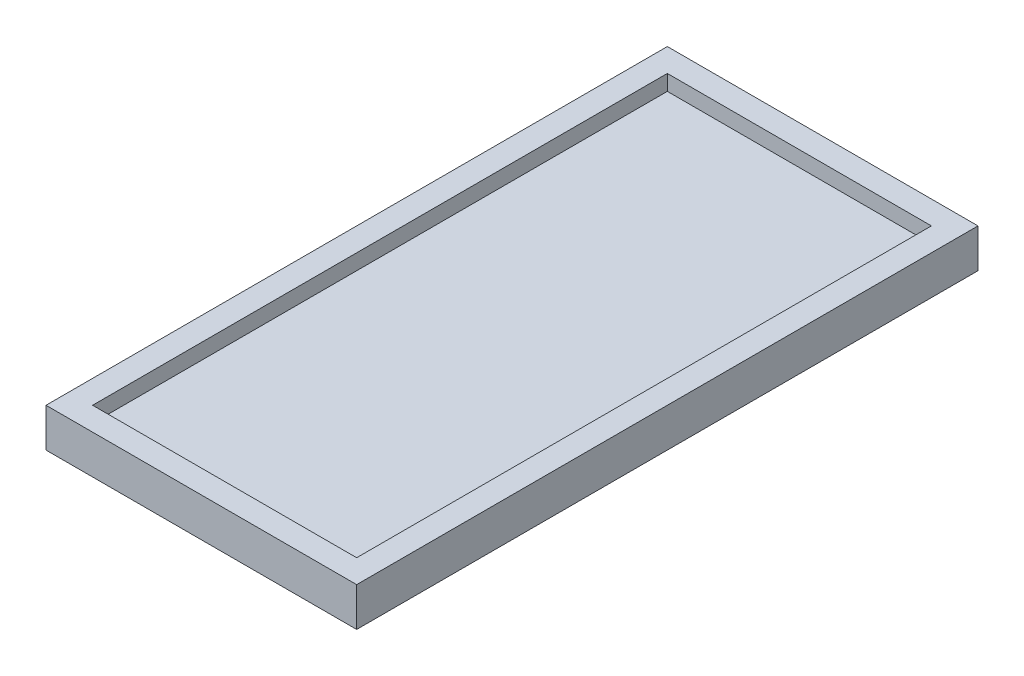
ISO-10303-21;
HEADER;
FILE_DESCRIPTION(('STEP AP214'),'2;1');
FILE_NAME('part.step','',(''),(''),'','','');
FILE_SCHEMA(('AUTOMOTIVE_DESIGN { 1 0 10303 214 1 1 1 1 }'));
ENDSEC;
DATA;
#1=APPLICATION_CONTEXT('core data for automotive mechanical design processes');
#2=APPLICATION_PROTOCOL_DEFINITION('international standard','automotive_design',2000,#1);
#3=PRODUCT_CONTEXT('',#1,'mechanical');
#4=PRODUCT('Part','Part','',(#3));
#5=PRODUCT_RELATED_PRODUCT_CATEGORY('part','',(#4));
#6=PRODUCT_DEFINITION_FORMATION('','',#4);
#7=PRODUCT_DEFINITION_CONTEXT('part definition',#1,'design');
#8=PRODUCT_DEFINITION('design','',#6,#7);
#9=PRODUCT_DEFINITION_SHAPE('','',#8);
#10=(LENGTH_UNIT() NAMED_UNIT(*) SI_UNIT(.MILLI.,.METRE.));
#11=(NAMED_UNIT(*) PLANE_ANGLE_UNIT() SI_UNIT($,.RADIAN.));
#12=(NAMED_UNIT(*) SI_UNIT($,.STERADIAN.) SOLID_ANGLE_UNIT());
#13=UNCERTAINTY_MEASURE_WITH_UNIT(LENGTH_MEASURE(1.E-05),#10,'distance_accuracy_value','');
#14=(GEOMETRIC_REPRESENTATION_CONTEXT(3) GLOBAL_UNCERTAINTY_ASSIGNED_CONTEXT((#13)) GLOBAL_UNIT_ASSIGNED_CONTEXT((#10,
#11,#12)) REPRESENTATION_CONTEXT('',''));
#15=CARTESIAN_POINT('',(0.,0.,0.));
#16=DIRECTION('',(0.,0.,1.));
#17=DIRECTION('',(1.,0.,0.));
#18=AXIS2_PLACEMENT_3D('',#15,#16,#17);
#19=CARTESIAN_POINT('',(20.,3.,40.));
#20=DIRECTION('',(-1.,0.,0.));
#21=DIRECTION('',(0.,0.,1.));
#22=AXIS2_PLACEMENT_3D('',#19,#20,#21);
#23=PLANE('',#22);
#24=DIRECTION('',(0.,0.,-1.));
#25=VECTOR('',#24,1.);
#26=CARTESIAN_POINT('',(20.,0.,40.));
#27=LINE('',#26,#25);
#28=CARTESIAN_POINT('',(20.,0.,40.));
#29=VERTEX_POINT('',#28);
#30=CARTESIAN_POINT('',(20.,0.,-40.));
#31=VERTEX_POINT('',#30);
#32=EDGE_CURVE('E152',#29,#31,#27,.T.);
#33=ORIENTED_EDGE('',*,*,#32,.T.);
#34=DIRECTION('',(0.,-1.,0.));
#35=VECTOR('',#34,1.);
#36=CARTESIAN_POINT('',(20.,3.,-40.));
#37=LINE('',#36,#35);
#38=CARTESIAN_POINT('',(20.,5.,-40.));
#39=VERTEX_POINT('',#38);
#40=EDGE_CURVE('E11',#39,#31,#37,.T.);
#41=ORIENTED_EDGE('',*,*,#40,.F.);
#42=DIRECTION('',(0.,0.,-1.));
#43=VECTOR('',#42,1.);
#44=CARTESIAN_POINT('',(20.,5.,40.));
#45=LINE('',#44,#43);
#46=CARTESIAN_POINT('',(20.,5.,40.));
#47=VERTEX_POINT('',#46);
#48=EDGE_CURVE('E143',#47,#39,#45,.T.);
#49=ORIENTED_EDGE('',*,*,#48,.F.);
#50=DIRECTION('',(0.,-1.,0.));
#51=VECTOR('',#50,1.);
#52=CARTESIAN_POINT('',(20.,3.,40.));
#53=LINE('',#52,#51);
#54=EDGE_CURVE('E160',#47,#29,#53,.T.);
#55=ORIENTED_EDGE('',*,*,#54,.T.);
#56=EDGE_LOOP('',(#33,#41,#49,#55));
#57=FACE_BOUND('',#56,.T.);
#58=ADVANCED_FACE('F35',(#57),#23,.F.);
#59=CARTESIAN_POINT('',(-20.,3.,-40.));
#60=DIRECTION('',(0.,0.,1.));
#61=DIRECTION('',(1.,0.,0.));
#62=AXIS2_PLACEMENT_3D('',#59,#60,#61);
#63=PLANE('',#62);
#64=DIRECTION('',(-1.,0.,0.));
#65=VECTOR('',#64,1.);
#66=CARTESIAN_POINT('',(-20.,0.,-40.));
#67=LINE('',#66,#65);
#68=CARTESIAN_POINT('',(-20.,0.,-40.));
#69=VERTEX_POINT('',#68);
#70=EDGE_CURVE('E155',#31,#69,#67,.T.);
#71=ORIENTED_EDGE('',*,*,#70,.T.);
#72=DIRECTION('',(0.,-1.,0.));
#73=VECTOR('',#72,1.);
#74=CARTESIAN_POINT('',(-20.,3.,-40.));
#75=LINE('',#74,#73);
#76=CARTESIAN_POINT('',(-20.,5.,-40.));
#77=VERTEX_POINT('',#76);
#78=EDGE_CURVE('E42',#77,#69,#75,.T.);
#79=ORIENTED_EDGE('',*,*,#78,.F.);
#80=DIRECTION('',(-1.,0.,0.));
#81=VECTOR('',#80,1.);
#82=CARTESIAN_POINT('',(20.,5.,-40.));
#83=LINE('',#82,#81);
#84=EDGE_CURVE('E146',#39,#77,#83,.T.);
#85=ORIENTED_EDGE('',*,*,#84,.F.);
#86=ORIENTED_EDGE('',*,*,#40,.T.);
#87=EDGE_LOOP('',(#71,#79,#85,#86));
#88=FACE_BOUND('',#87,.T.);
#89=ADVANCED_FACE('F178',(#88),#63,.F.);
#90=CARTESIAN_POINT('',(-20.,3.,40.));
#91=DIRECTION('',(1.,0.,0.));
#92=DIRECTION('',(0.,0.,-1.));
#93=AXIS2_PLACEMENT_3D('',#90,#91,#92);
#94=PLANE('',#93);
#95=DIRECTION('',(0.,0.,1.));
#96=VECTOR('',#95,1.);
#97=CARTESIAN_POINT('',(-20.,0.,40.));
#98=LINE('',#97,#96);
#99=CARTESIAN_POINT('',(-20.,0.,40.));
#100=VERTEX_POINT('',#99);
#101=EDGE_CURVE('E157',#69,#100,#98,.T.);
#102=ORIENTED_EDGE('',*,*,#101,.T.);
#103=DIRECTION('',(0.,-1.,0.));
#104=VECTOR('',#103,1.);
#105=CARTESIAN_POINT('',(-20.,3.,40.));
#106=LINE('',#105,#104);
#107=CARTESIAN_POINT('',(-20.,5.,40.));
#108=VERTEX_POINT('',#107);
#109=EDGE_CURVE('E162',#108,#100,#106,.T.);
#110=ORIENTED_EDGE('',*,*,#109,.F.);
#111=DIRECTION('',(0.,0.,1.));
#112=VECTOR('',#111,1.);
#113=CARTESIAN_POINT('',(-20.,5.,-40.));
#114=LINE('',#113,#112);
#115=EDGE_CURVE('E149',#77,#108,#114,.T.);
#116=ORIENTED_EDGE('',*,*,#115,.F.);
#117=ORIENTED_EDGE('',*,*,#78,.T.);
#118=EDGE_LOOP('',(#102,#110,#116,#117));
#119=FACE_BOUND('',#118,.T.);
#120=ADVANCED_FACE('F167',(#119),#94,.F.);
#121=CARTESIAN_POINT('',(-20.,3.,40.));
#122=DIRECTION('',(0.,0.,-1.));
#123=DIRECTION('',(-1.,0.,0.));
#124=AXIS2_PLACEMENT_3D('',#121,#122,#123);
#125=PLANE('',#124);
#126=DIRECTION('',(1.,0.,0.));
#127=VECTOR('',#126,1.);
#128=CARTESIAN_POINT('',(-20.,0.,40.));
#129=LINE('',#128,#127);
#130=EDGE_CURVE('E57',#100,#29,#129,.T.);
#131=ORIENTED_EDGE('',*,*,#130,.T.);
#132=ORIENTED_EDGE('',*,*,#54,.F.);
#133=DIRECTION('',(1.,0.,0.));
#134=VECTOR('',#133,1.);
#135=CARTESIAN_POINT('',(-20.,5.,40.));
#136=LINE('',#135,#134);
#137=EDGE_CURVE('E117',#108,#47,#136,.T.);
#138=ORIENTED_EDGE('',*,*,#137,.F.);
#139=ORIENTED_EDGE('',*,*,#109,.T.);
#140=EDGE_LOOP('',(#131,#132,#138,#139));
#141=FACE_BOUND('',#140,.T.);
#142=ADVANCED_FACE('F176',(#141),#125,.F.);
#143=CARTESIAN_POINT('',(0.,0.,0.));
#144=DIRECTION('',(0.,-1.,0.));
#145=DIRECTION('',(0.,0.,-1.));
#146=AXIS2_PLACEMENT_3D('',#143,#144,#145);
#147=PLANE('',#146);
#148=ORIENTED_EDGE('',*,*,#32,.F.);
#149=ORIENTED_EDGE('',*,*,#130,.F.);
#150=ORIENTED_EDGE('',*,*,#101,.F.);
#151=ORIENTED_EDGE('',*,*,#70,.F.);
#152=EDGE_LOOP('',(#148,#149,#150,#151));
#153=FACE_BOUND('',#152,.T.);
#154=ADVANCED_FACE('F172',(#153),#147,.T.);
#155=CARTESIAN_POINT('',(0.,5.,0.));
#156=DIRECTION('',(0.,1.,0.));
#157=DIRECTION('',(0.,0.,1.));
#158=AXIS2_PLACEMENT_3D('',#155,#156,#157);
#159=PLANE('',#158);
#160=ORIENTED_EDGE('',*,*,#137,.T.);
#161=ORIENTED_EDGE('',*,*,#48,.T.);
#162=ORIENTED_EDGE('',*,*,#84,.T.);
#163=ORIENTED_EDGE('',*,*,#115,.T.);
#164=EDGE_LOOP('',(#160,#161,#162,#163));
#165=FACE_BOUND('',#164,.T.);
#166=DIRECTION('',(-1.,0.,0.));
#167=VECTOR('',#166,1.);
#168=CARTESIAN_POINT('',(17.,5.,-37.));
#169=LINE('',#168,#167);
#170=CARTESIAN_POINT('',(17.,5.,-37.));
#171=VERTEX_POINT('',#170);
#172=CARTESIAN_POINT('',(-17.,5.,-37.));
#173=VERTEX_POINT('',#172);
#174=EDGE_CURVE('E109',#171,#173,#169,.T.);
#175=ORIENTED_EDGE('',*,*,#174,.F.);
#176=DIRECTION('',(0.,0.,-1.));
#177=VECTOR('',#176,1.);
#178=CARTESIAN_POINT('',(17.,5.,37.));
#179=LINE('',#178,#177);
#180=CARTESIAN_POINT('',(17.,5.,37.));
#181=VERTEX_POINT('',#180);
#182=EDGE_CURVE('E101',#181,#171,#179,.T.);
#183=ORIENTED_EDGE('',*,*,#182,.F.);
#184=DIRECTION('',(1.,0.,0.));
#185=VECTOR('',#184,1.);
#186=CARTESIAN_POINT('',(-17.,5.,37.));
#187=LINE('',#186,#185);
#188=CARTESIAN_POINT('',(-17.,5.,37.));
#189=VERTEX_POINT('',#188);
#190=EDGE_CURVE('E125',#189,#181,#187,.T.);
#191=ORIENTED_EDGE('',*,*,#190,.F.);
#192=DIRECTION('',(0.,0.,1.));
#193=VECTOR('',#192,1.);
#194=CARTESIAN_POINT('',(-17.,5.,-37.));
#195=LINE('',#194,#193);
#196=EDGE_CURVE('E123',#173,#189,#195,.T.);
#197=ORIENTED_EDGE('',*,*,#196,.F.);
#198=EDGE_LOOP('',(#175,#183,#191,#197));
#199=FACE_BOUND('',#198,.T.);
#200=ADVANCED_FACE('F121',(#165,#199),#159,.T.);
#201=CARTESIAN_POINT('',(17.,5.,37.));
#202=DIRECTION('',(-1.,0.,0.));
#203=DIRECTION('',(0.,0.,1.));
#204=AXIS2_PLACEMENT_3D('',#201,#202,#203);
#205=PLANE('',#204);
#206=DIRECTION('',(0.,0.,-1.));
#207=VECTOR('',#206,1.);
#208=CARTESIAN_POINT('',(17.,3.,37.));
#209=LINE('',#208,#207);
#210=CARTESIAN_POINT('',(17.,3.,37.));
#211=VERTEX_POINT('',#210);
#212=CARTESIAN_POINT('',(17.,3.,-37.));
#213=VERTEX_POINT('',#212);
#214=EDGE_CURVE('E129',#211,#213,#209,.T.);
#215=ORIENTED_EDGE('',*,*,#214,.F.);
#216=DIRECTION('',(0.,-1.,0.));
#217=VECTOR('',#216,1.);
#218=CARTESIAN_POINT('',(17.,5.,37.));
#219=LINE('',#218,#217);
#220=EDGE_CURVE('E49',#181,#211,#219,.T.);
#221=ORIENTED_EDGE('',*,*,#220,.F.);
#222=ORIENTED_EDGE('',*,*,#182,.T.);
#223=DIRECTION('',(0.,-1.,0.));
#224=VECTOR('',#223,1.);
#225=CARTESIAN_POINT('',(17.,5.,-37.));
#226=LINE('',#225,#224);
#227=EDGE_CURVE('E104',#171,#213,#226,.T.);
#228=ORIENTED_EDGE('',*,*,#227,.T.);
#229=EDGE_LOOP('',(#215,#221,#222,#228));
#230=FACE_BOUND('',#229,.T.);
#231=ADVANCED_FACE('F103',(#230),#205,.T.);
#232=CARTESIAN_POINT('',(17.,5.,-37.));
#233=DIRECTION('',(0.,0.,1.));
#234=DIRECTION('',(1.,0.,0.));
#235=AXIS2_PLACEMENT_3D('',#232,#233,#234);
#236=PLANE('',#235);
#237=DIRECTION('',(-1.,0.,0.));
#238=VECTOR('',#237,1.);
#239=CARTESIAN_POINT('',(17.,3.,-37.));
#240=LINE('',#239,#238);
#241=CARTESIAN_POINT('',(-17.,3.,-37.));
#242=VERTEX_POINT('',#241);
#243=EDGE_CURVE('E116',#213,#242,#240,.T.);
#244=ORIENTED_EDGE('',*,*,#243,.F.);
#245=ORIENTED_EDGE('',*,*,#227,.F.);
#246=ORIENTED_EDGE('',*,*,#174,.T.);
#247=DIRECTION('',(0.,-1.,0.));
#248=VECTOR('',#247,1.);
#249=CARTESIAN_POINT('',(-17.,5.,-37.));
#250=LINE('',#249,#248);
#251=EDGE_CURVE('E118',#173,#242,#250,.T.);
#252=ORIENTED_EDGE('',*,*,#251,.T.);
#253=EDGE_LOOP('',(#244,#245,#246,#252));
#254=FACE_BOUND('',#253,.T.);
#255=ADVANCED_FACE('F113',(#254),#236,.T.);
#256=CARTESIAN_POINT('',(-17.,5.,-37.));
#257=DIRECTION('',(1.,0.,0.));
#258=DIRECTION('',(0.,0.,-1.));
#259=AXIS2_PLACEMENT_3D('',#256,#257,#258);
#260=PLANE('',#259);
#261=DIRECTION('',(0.,0.,1.));
#262=VECTOR('',#261,1.);
#263=CARTESIAN_POINT('',(-17.,3.,-37.));
#264=LINE('',#263,#262);
#265=CARTESIAN_POINT('',(-17.,3.,37.));
#266=VERTEX_POINT('',#265);
#267=EDGE_CURVE('E132',#242,#266,#264,.T.);
#268=ORIENTED_EDGE('',*,*,#267,.F.);
#269=ORIENTED_EDGE('',*,*,#251,.F.);
#270=ORIENTED_EDGE('',*,*,#196,.T.);
#271=DIRECTION('',(0.,-1.,0.));
#272=VECTOR('',#271,1.);
#273=CARTESIAN_POINT('',(-17.,5.,37.));
#274=LINE('',#273,#272);
#275=EDGE_CURVE('E138',#189,#266,#274,.T.);
#276=ORIENTED_EDGE('',*,*,#275,.T.);
#277=EDGE_LOOP('',(#268,#269,#270,#276));
#278=FACE_BOUND('',#277,.T.);
#279=ADVANCED_FACE('F201',(#278),#260,.T.);
#280=CARTESIAN_POINT('',(-17.,5.,37.));
#281=DIRECTION('',(0.,0.,-1.));
#282=DIRECTION('',(-1.,0.,0.));
#283=AXIS2_PLACEMENT_3D('',#280,#281,#282);
#284=PLANE('',#283);
#285=DIRECTION('',(1.,0.,0.));
#286=VECTOR('',#285,1.);
#287=CARTESIAN_POINT('',(-17.,3.,37.));
#288=LINE('',#287,#286);
#289=EDGE_CURVE('E110',#266,#211,#288,.T.);
#290=ORIENTED_EDGE('',*,*,#289,.F.);
#291=ORIENTED_EDGE('',*,*,#275,.F.);
#292=ORIENTED_EDGE('',*,*,#190,.T.);
#293=ORIENTED_EDGE('',*,*,#220,.T.);
#294=EDGE_LOOP('',(#290,#291,#292,#293));
#295=FACE_BOUND('',#294,.T.);
#296=ADVANCED_FACE('F193',(#295),#284,.T.);
#297=CARTESIAN_POINT('',(0.,3.,0.));
#298=DIRECTION('',(0.,-1.,0.));
#299=DIRECTION('',(0.,0.,-1.));
#300=AXIS2_PLACEMENT_3D('',#297,#298,#299);
#301=PLANE('',#300);
#302=ORIENTED_EDGE('',*,*,#289,.T.);
#303=ORIENTED_EDGE('',*,*,#214,.T.);
#304=ORIENTED_EDGE('',*,*,#243,.T.);
#305=ORIENTED_EDGE('',*,*,#267,.T.);
#306=EDGE_LOOP('',(#302,#303,#304,#305));
#307=FACE_BOUND('',#306,.T.);
#308=ADVANCED_FACE('F190',(#307),#301,.F.);
#309=CLOSED_SHELL('',(#58,#89,#120,#142,#154,#200,#231,#255,#279,#296,#308));
#310=MANIFOLD_SOLID_BREP('B2',#309);
#311=ADVANCED_BREP_SHAPE_REPRESENTATION('',(#18,#310),#14);
#312=SHAPE_DEFINITION_REPRESENTATION(#9,#311);
ENDSEC;
END-ISO-10303-21;
